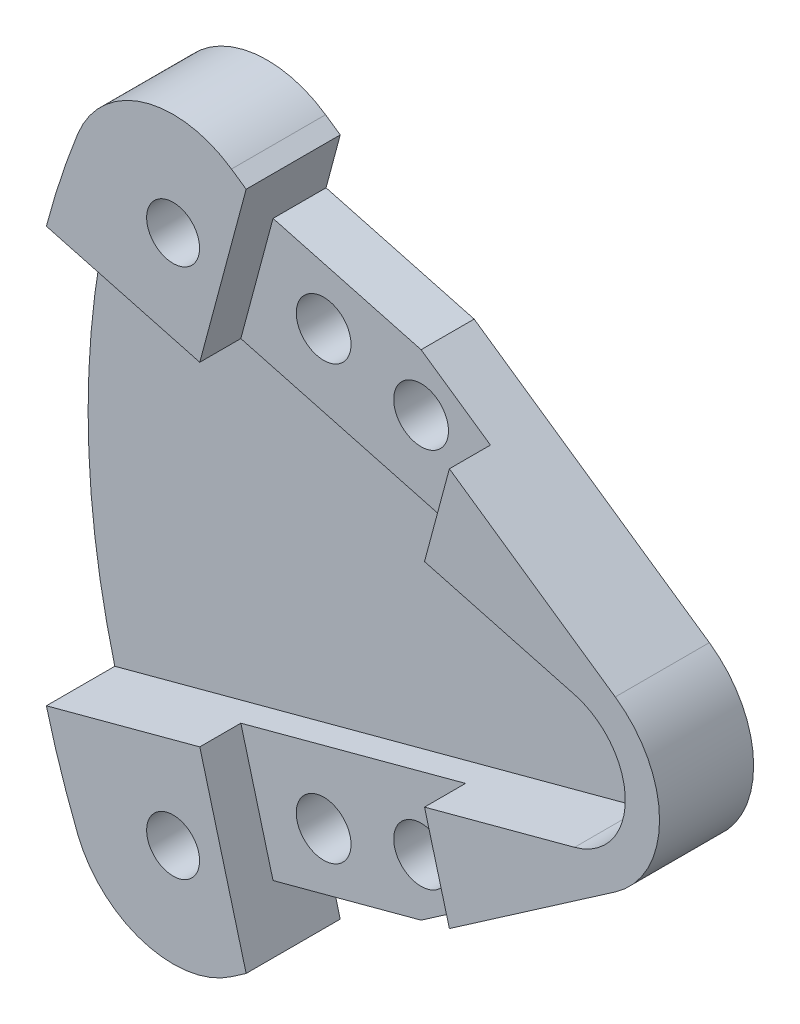
ISO-10303-21;
HEADER;
FILE_DESCRIPTION(('STEP AP214'),'2;1');
FILE_NAME('part.step','',(''),(''),'','','');
FILE_SCHEMA(('AUTOMOTIVE_DESIGN { 1 0 10303 214 1 1 1 1 }'));
ENDSEC;
DATA;
#1=APPLICATION_CONTEXT('core data for automotive mechanical design processes');
#2=APPLICATION_PROTOCOL_DEFINITION('international standard','automotive_design',2000,#1);
#3=PRODUCT_CONTEXT('',#1,'mechanical');
#4=PRODUCT('Part','Part','',(#3));
#5=PRODUCT_RELATED_PRODUCT_CATEGORY('part','',(#4));
#6=PRODUCT_DEFINITION_FORMATION('','',#4);
#7=PRODUCT_DEFINITION_CONTEXT('part definition',#1,'design');
#8=PRODUCT_DEFINITION('design','',#6,#7);
#9=PRODUCT_DEFINITION_SHAPE('','',#8);
#10=(LENGTH_UNIT() NAMED_UNIT(*) SI_UNIT(.MILLI.,.METRE.));
#11=(NAMED_UNIT(*) PLANE_ANGLE_UNIT() SI_UNIT($,.RADIAN.));
#12=(NAMED_UNIT(*) SI_UNIT($,.STERADIAN.) SOLID_ANGLE_UNIT());
#13=UNCERTAINTY_MEASURE_WITH_UNIT(LENGTH_MEASURE(1.E-05),#10,'distance_accuracy_value','');
#14=(GEOMETRIC_REPRESENTATION_CONTEXT(3) GLOBAL_UNCERTAINTY_ASSIGNED_CONTEXT((#13)) GLOBAL_UNIT_ASSIGNED_CONTEXT((#10,
#11,#12)) REPRESENTATION_CONTEXT('',''));
#15=CARTESIAN_POINT('',(0.,0.,0.));
#16=DIRECTION('',(0.,0.,1.));
#17=DIRECTION('',(1.,0.,0.));
#18=AXIS2_PLACEMENT_3D('',#15,#16,#17);
#19=CARTESIAN_POINT('',(33.2996809294023,0.,-8.73125));
#20=DIRECTION('',(-0.568627450980392,0.822595175035413,0.));
#21=DIRECTION('',(-0.822595175035413,-0.568627450980392,0.));
#22=AXIS2_PLACEMENT_3D('',#19,#20,#21);
#23=PLANE('',#22);
#24=DIRECTION('',(0.822595175035413,0.568627450980392,0.));
#25=VECTOR('',#24,1.);
#26=CARTESIAN_POINT('',(33.2996809294023,0.,-8.73125));
#27=LINE('',#26,#25);
#28=CARTESIAN_POINT('',(-13.64748248226,-32.4527138885591,-8.73125));
#29=VERTEX_POINT('',#28);
#30=CARTESIAN_POINT('',(-12.2859096671348,-31.5115125507863,-8.73125));
#31=VERTEX_POINT('',#30);
#32=EDGE_CURVE('E229',#29,#31,#27,.T.);
#33=ORIENTED_EDGE('',*,*,#32,.T.);
#34=DIRECTION('',(0.,0.,-1.));
#35=VECTOR('',#34,1.);
#36=CARTESIAN_POINT('',(-12.2859096671348,-31.5115125507863,-8.73125));
#37=LINE('',#36,#35);
#38=CARTESIAN_POINT('',(-12.2859096671348,-31.5115125507863,0.));
#39=VERTEX_POINT('',#38);
#40=EDGE_CURVE('E210',#39,#31,#37,.T.);
#41=ORIENTED_EDGE('',*,*,#40,.F.);
#42=DIRECTION('',(0.822595175035413,0.568627450980392,0.));
#43=VECTOR('',#42,1.);
#44=CARTESIAN_POINT('',(33.2996809294023,0.,0.));
#45=LINE('',#44,#43);
#46=CARTESIAN_POINT('',(-13.64748248226,-32.4527138885591,0.));
#47=VERTEX_POINT('',#46);
#48=EDGE_CURVE('E247',#47,#39,#45,.T.);
#49=ORIENTED_EDGE('',*,*,#48,.F.);
#50=DIRECTION('',(0.,0.,1.));
#51=VECTOR('',#50,1.);
#52=CARTESIAN_POINT('',(-13.64748248226,-32.4527138885591,0.));
#53=LINE('',#52,#51);
#54=EDGE_CURVE('E66',#29,#47,#53,.T.);
#55=ORIENTED_EDGE('',*,*,#54,.F.);
#56=EDGE_LOOP('',(#33,#41,#49,#55));
#57=FACE_BOUND('',#56,.T.);
#58=ADVANCED_FACE('F57',(#57),#23,.F.);
#59=CARTESIAN_POINT('',(33.2996809294023,0.,-8.73125));
#60=DIRECTION('',(-0.568627450980392,-0.822595175035413,0.));
#61=DIRECTION('',(0.822595175035413,-0.568627450980392,0.));
#62=AXIS2_PLACEMENT_3D('',#59,#60,#61);
#63=PLANE('',#62);
#64=DIRECTION('',(0.,0.,1.));
#65=VECTOR('',#64,1.);
#66=CARTESIAN_POINT('',(-12.2859096671348,31.5115125507863,-8.73125));
#67=LINE('',#66,#65);
#68=CARTESIAN_POINT('',(-12.2859096671348,31.5115125507863,-8.73125));
#69=VERTEX_POINT('',#68);
#70=CARTESIAN_POINT('',(-12.2859096671348,31.5115125507863,0.));
#71=VERTEX_POINT('',#70);
#72=EDGE_CURVE('E343',#69,#71,#67,.T.);
#73=ORIENTED_EDGE('',*,*,#72,.F.);
#74=DIRECTION('',(-0.822595175035413,0.568627450980392,0.));
#75=VECTOR('',#74,1.);
#76=CARTESIAN_POINT('',(33.2996809294023,0.,-8.73125));
#77=LINE('',#76,#75);
#78=CARTESIAN_POINT('',(-13.64748248226,32.4527138885591,-8.73125));
#79=VERTEX_POINT('',#78);
#80=EDGE_CURVE('E235',#69,#79,#77,.T.);
#81=ORIENTED_EDGE('',*,*,#80,.T.);
#82=DIRECTION('',(0.,0.,1.));
#83=VECTOR('',#82,1.);
#84=CARTESIAN_POINT('',(-13.64748248226,32.4527138885591,-8.73125));
#85=LINE('',#84,#83);
#86=CARTESIAN_POINT('',(-13.64748248226,32.4527138885591,0.));
#87=VERTEX_POINT('',#86);
#88=EDGE_CURVE('E272',#87,#79,#85,.F.);
#89=ORIENTED_EDGE('',*,*,#88,.F.);
#90=DIRECTION('',(-0.822595175035413,0.568627450980392,0.));
#91=VECTOR('',#90,1.);
#92=CARTESIAN_POINT('',(33.2996809294023,0.,0.));
#93=LINE('',#92,#91);
#94=EDGE_CURVE('E249',#71,#87,#93,.T.);
#95=ORIENTED_EDGE('',*,*,#94,.F.);
#96=EDGE_LOOP('',(#73,#81,#89,#95));
#97=FACE_BOUND('',#96,.T.);
#98=ADVANCED_FACE('F471',(#97),#63,.F.);
#99=CARTESIAN_POINT('',(0.,0.,0.));
#100=DIRECTION('',(0.,0.,1.));
#101=DIRECTION('',(-1.,0.,0.));
#102=AXIS2_PLACEMENT_3D('',#99,#100,#101);
#103=PLANE('',#102);
#104=DIRECTION('',(-0.258819045102521,0.965925826289068,0.));
#105=VECTOR('',#104,1.);
#106=CARTESIAN_POINT('',(-16.588726312697,-15.4531822138951,0.));
#107=LINE('',#106,#105);
#108=CARTESIAN_POINT('',(-16.588726312697,-15.4531822138951,0.));
#109=VERTEX_POINT('',#108);
#110=EDGE_CURVE('E216',#39,#109,#107,.T.);
#111=ORIENTED_EDGE('',*,*,#110,.T.);
#112=DIRECTION('',(-0.965925826289068,-0.258819045102522,0.));
#113=VECTOR('',#112,1.);
#114=CARTESIAN_POINT('',(-30.8235420478515,-19.2673895945356,0.));
#115=LINE('',#114,#113);
#116=CARTESIAN_POINT('',(-30.8235420478515,-19.2673895945356,0.));
#117=VERTEX_POINT('',#116);
#118=EDGE_CURVE('E291',#109,#117,#115,.T.);
#119=ORIENTED_EDGE('',*,*,#118,.T.);
#120=CARTESIAN_POINT('',(42.9003190705977,0.,0.));
#121=DIRECTION('',(0.,0.,-1.));
#122=DIRECTION('',(-1.,0.,0.));
#123=AXIS2_PLACEMENT_3D('',#120,#121,#122);
#124=CIRCLE('',#123,76.2);
#125=CARTESIAN_POINT('',(-27.9156558133405,-28.1342798243964,0.));
#126=VERTEX_POINT('',#125);
#127=EDGE_CURVE('E254',#126,#117,#124,.T.);
#128=ORIENTED_EDGE('',*,*,#127,.F.);
#129=CARTESIAN_POINT('',(-19.0636589528482,-24.6174948463468,0.));
#130=DIRECTION('',(0.,0.,-1.));
#131=DIRECTION('',(-1.,0.,0.));
#132=AXIS2_PLACEMENT_3D('',#129,#130,#131);
#133=CIRCLE('',#132,9.525);
#134=EDGE_CURVE('E261',#47,#126,#133,.T.);
#135=ORIENTED_EDGE('',*,*,#134,.F.);
#136=ORIENTED_EDGE('',*,*,#48,.T.);
#137=EDGE_LOOP('',(#111,#119,#128,#135,#136));
#138=FACE_BOUND('',#137,.T.);
#139=CARTESIAN_POINT('',(-19.0636589528482,-24.6174948463468,0.));
#140=DIRECTION('',(0.,0.,-1.));
#141=DIRECTION('',(-1.,0.,0.));
#142=AXIS2_PLACEMENT_3D('',#139,#140,#141);
#143=CIRCLE('',#142,2.45745);
#144=CARTESIAN_POINT('',(-21.5211089528482,-24.6174948463468,0.));
#145=VERTEX_POINT('',#144);
#146=EDGE_CURVE('E306',#145,#145,#143,.T.);
#147=ORIENTED_EDGE('',*,*,#146,.T.);
#148=EDGE_LOOP('',(#147));
#149=FACE_BOUND('',#148,.T.);
#150=ADVANCED_FACE('F287',(#138,#149),#103,.T.);
#151=DIRECTION('',(0.258819045102521,0.965925826289068,0.));
#152=VECTOR('',#151,1.);
#153=CARTESIAN_POINT('',(-16.588726312697,15.4531822138951,0.));
#154=LINE('',#153,#152);
#155=CARTESIAN_POINT('',(-16.588726312697,15.4531822138951,0.));
#156=VERTEX_POINT('',#155);
#157=EDGE_CURVE('E363',#156,#71,#154,.T.);
#158=ORIENTED_EDGE('',*,*,#157,.T.);
#159=ORIENTED_EDGE('',*,*,#94,.T.);
#160=CARTESIAN_POINT('',(-19.0636589528482,24.6174948463468,0.));
#161=DIRECTION('',(0.,0.,-1.));
#162=DIRECTION('',(-1.,0.,0.));
#163=AXIS2_PLACEMENT_3D('',#160,#161,#162);
#164=CIRCLE('',#163,9.525);
#165=CARTESIAN_POINT('',(-27.9156558133405,28.1342798243964,0.));
#166=VERTEX_POINT('',#165);
#167=EDGE_CURVE('E266',#166,#87,#164,.T.);
#168=ORIENTED_EDGE('',*,*,#167,.F.);
#169=CARTESIAN_POINT('',(-30.8235420478515,19.2673895945356,0.));
#170=VERTEX_POINT('',#169);
#171=EDGE_CURVE('E246',#170,#166,#124,.T.);
#172=ORIENTED_EDGE('',*,*,#171,.F.);
#173=DIRECTION('',(0.965925826289068,-0.258819045102522,0.));
#174=VECTOR('',#173,1.);
#175=CARTESIAN_POINT('',(-30.8235420478515,19.2673895945356,0.));
#176=LINE('',#175,#174);
#177=EDGE_CURVE('E327',#170,#156,#176,.T.);
#178=ORIENTED_EDGE('',*,*,#177,.T.);
#179=EDGE_LOOP('',(#158,#159,#168,#172,#178));
#180=FACE_BOUND('',#179,.T.);
#181=CARTESIAN_POINT('',(-19.0636589528482,24.6174948463468,0.));
#182=DIRECTION('',(0.,0.,-1.));
#183=DIRECTION('',(-1.,0.,0.));
#184=AXIS2_PLACEMENT_3D('',#181,#182,#183);
#185=CIRCLE('',#184,2.45745);
#186=CARTESIAN_POINT('',(-21.5211089528482,24.6174948463468,0.));
#187=VERTEX_POINT('',#186);
#188=EDGE_CURVE('E302',#187,#187,#185,.T.);
#189=ORIENTED_EDGE('',*,*,#188,.T.);
#190=EDGE_LOOP('',(#189));
#191=FACE_BOUND('',#190,.T.);
#192=ADVANCED_FACE('F463',(#180,#191),#103,.T.);
#193=CARTESIAN_POINT('',(16.5488188604368,0.,-8.73125));
#194=DIRECTION('',(0.,0.,-1.));
#195=DIRECTION('',(1.,0.,0.));
#196=AXIS2_PLACEMENT_3D('',#193,#194,#195);
#197=CYLINDRICAL_SURFACE('',#196,2.45745);
#198=CARTESIAN_POINT('',(16.5488188604368,0.,-6.35));
#199=DIRECTION('',(0.,0.,-1.));
#200=DIRECTION('',(-1.,0.,0.));
#201=AXIS2_PLACEMENT_3D('',#198,#199,#200);
#202=CIRCLE('',#201,2.45745);
#203=CARTESIAN_POINT('',(14.0913688604368,0.,-6.35));
#204=VERTEX_POINT('',#203);
#205=EDGE_CURVE('E61',#204,#204,#202,.F.);
#206=ORIENTED_EDGE('',*,*,#205,.T.);
#207=EDGE_LOOP('',(#206));
#208=FACE_BOUND('',#207,.T.);
#209=CARTESIAN_POINT('',(16.5488188604368,0.,-8.73125));
#210=DIRECTION('',(0.,0.,-1.));
#211=DIRECTION('',(-1.,0.,0.));
#212=AXIS2_PLACEMENT_3D('',#209,#210,#211);
#213=CIRCLE('',#212,2.45745);
#214=CARTESIAN_POINT('',(14.0913688604368,0.,-8.73125));
#215=VERTEX_POINT('',#214);
#216=EDGE_CURVE('E413',#215,#215,#213,.T.);
#217=ORIENTED_EDGE('',*,*,#216,.T.);
#218=EDGE_LOOP('',(#217));
#219=FACE_BOUND('',#218,.T.);
#220=ADVANCED_FACE('F524',(#208,#219),#197,.F.);
#221=CARTESIAN_POINT('',(0.,0.,-8.73125));
#222=DIRECTION('',(0.,0.,1.));
#223=DIRECTION('',(-1.,0.,0.));
#224=AXIS2_PLACEMENT_3D('',#221,#222,#223);
#225=PLANE('',#224);
#226=CARTESIAN_POINT('',(0.136283199039551,-17.6640652348489,-8.73125));
#227=DIRECTION('',(0.,0.,1.));
#228=DIRECTION('',(1.,0.,0.));
#229=AXIS2_PLACEMENT_3D('',#226,#227,#228);
#230=CIRCLE('',#229,2.54);
#231=CARTESIAN_POINT('',(2.67628319903955,-17.6640652348489,-8.73125));
#232=VERTEX_POINT('',#231);
#233=EDGE_CURVE('E394',#232,#232,#230,.F.);
#234=ORIENTED_EDGE('',*,*,#233,.F.);
#235=EDGE_LOOP('',(#234));
#236=FACE_BOUND('',#235,.T.);
#237=CARTESIAN_POINT('',(-8.9046859424435,20.086585615104,-8.73125));
#238=DIRECTION('',(0.,0.,1.));
#239=DIRECTION('',(1.,0.,0.));
#240=AXIS2_PLACEMENT_3D('',#237,#238,#239);
#241=CIRCLE('',#240,2.54);
#242=CARTESIAN_POINT('',(-6.36468594244349,20.086585615104,-8.73125));
#243=VERTEX_POINT('',#242);
#244=EDGE_CURVE('E395',#243,#243,#241,.F.);
#245=ORIENTED_EDGE('',*,*,#244,.F.);
#246=EDGE_LOOP('',(#245));
#247=FACE_BOUND('',#246,.T.);
#248=CARTESIAN_POINT('',(0.136283199039557,17.6640652348489,-8.73125));
#249=DIRECTION('',(0.,0.,1.));
#250=DIRECTION('',(1.,0.,0.));
#251=AXIS2_PLACEMENT_3D('',#248,#249,#250);
#252=CIRCLE('',#251,2.54);
#253=CARTESIAN_POINT('',(2.67628319903956,17.6640652348489,-8.73125));
#254=VERTEX_POINT('',#253);
#255=EDGE_CURVE('E402',#254,#254,#252,.F.);
#256=ORIENTED_EDGE('',*,*,#255,.F.);
#257=EDGE_LOOP('',(#256));
#258=FACE_BOUND('',#257,.T.);
#259=CARTESIAN_POINT('',(-8.9046859424435,-20.086585615104,-8.73125));
#260=DIRECTION('',(0.,0.,1.));
#261=DIRECTION('',(1.,0.,0.));
#262=AXIS2_PLACEMENT_3D('',#259,#260,#261);
#263=CIRCLE('',#262,2.54);
#264=CARTESIAN_POINT('',(-6.3646859424435,-20.086585615104,-8.73125));
#265=VERTEX_POINT('',#264);
#266=EDGE_CURVE('E366',#265,#265,#263,.F.);
#267=ORIENTED_EDGE('',*,*,#266,.F.);
#268=EDGE_LOOP('',(#267));
#269=FACE_BOUND('',#268,.T.);
#270=DIRECTION('',(-0.965925826289068,-0.258819045102521,0.));
#271=VECTOR('',#270,1.);
#272=CARTESIAN_POINT('',(-13.6008416103196,-26.6041197303254,-8.73125));
#273=LINE('',#272,#271);
#274=CARTESIAN_POINT('',(0.139294206400589,-22.9224614343413,-8.73125));
#275=VERTEX_POINT('',#274);
#276=CARTESIAN_POINT('',(-13.6008416103196,-26.6041197303254,-8.73125));
#277=VERTEX_POINT('',#276);
#278=EDGE_CURVE('E231',#275,#277,#273,.T.);
#279=ORIENTED_EDGE('',*,*,#278,.T.);
#280=DIRECTION('',(0.258819045102522,-0.965925826289068,0.));
#281=VECTOR('',#280,1.);
#282=CARTESIAN_POINT('',(-12.2859096671348,-31.5115125507863,-8.73125));
#283=LINE('',#282,#281);
#284=EDGE_CURVE('E213',#277,#31,#283,.T.);
#285=ORIENTED_EDGE('',*,*,#284,.T.);
#286=ORIENTED_EDGE('',*,*,#32,.F.);
#287=CARTESIAN_POINT('',(-19.0636589528482,-24.6174948463468,-8.73125));
#288=DIRECTION('',(0.,0.,-1.));
#289=DIRECTION('',(-1.,0.,0.));
#290=AXIS2_PLACEMENT_3D('',#287,#288,#289);
#291=CIRCLE('',#290,9.525);
#292=CARTESIAN_POINT('',(-27.9156558133405,-28.1342798243964,-8.73125));
#293=VERTEX_POINT('',#292);
#294=EDGE_CURVE('E275',#293,#29,#291,.F.);
#295=ORIENTED_EDGE('',*,*,#294,.F.);
#296=CARTESIAN_POINT('',(42.9003190705977,0.,-8.73125));
#297=DIRECTION('',(0.,0.,1.));
#298=DIRECTION('',(1.,0.,0.));
#299=AXIS2_PLACEMENT_3D('',#296,#297,#298);
#300=CIRCLE('',#299,76.2);
#301=CARTESIAN_POINT('',(-27.9156558133405,28.1342798243964,-8.73125));
#302=VERTEX_POINT('',#301);
#303=EDGE_CURVE('E242',#302,#293,#300,.T.);
#304=ORIENTED_EDGE('',*,*,#303,.F.);
#305=CARTESIAN_POINT('',(-19.0636589528482,24.6174948463468,-8.73125));
#306=DIRECTION('',(0.,0.,-1.));
#307=DIRECTION('',(-1.,0.,0.));
#308=AXIS2_PLACEMENT_3D('',#305,#306,#307);
#309=CIRCLE('',#308,9.525);
#310=EDGE_CURVE('E280',#79,#302,#309,.F.);
#311=ORIENTED_EDGE('',*,*,#310,.F.);
#312=ORIENTED_EDGE('',*,*,#80,.F.);
#313=DIRECTION('',(-0.258819045102521,-0.965925826289068,0.));
#314=VECTOR('',#313,1.);
#315=CARTESIAN_POINT('',(-12.2859096671348,31.5115125507863,-8.73125));
#316=LINE('',#315,#314);
#317=CARTESIAN_POINT('',(-13.6008416103194,26.6041197303259,-8.73125));
#318=VERTEX_POINT('',#317);
#319=EDGE_CURVE('E430',#69,#318,#316,.T.);
#320=ORIENTED_EDGE('',*,*,#319,.T.);
#321=DIRECTION('',(0.96592582628906,-0.258819045102551,0.));
#322=VECTOR('',#321,1.);
#323=CARTESIAN_POINT('',(-13.6008416103194,26.6041197303259,-8.73125));
#324=LINE('',#323,#322);
#325=CARTESIAN_POINT('',(0.139294206400574,22.9224614343413,-8.73125));
#326=VERTEX_POINT('',#325);
#327=EDGE_CURVE('E425',#318,#326,#324,.T.);
#328=ORIENTED_EDGE('',*,*,#327,.T.);
#329=CARTESIAN_POINT('',(21.964995331025,7.83521904221231,-8.73125));
#330=VERTEX_POINT('',#329);
#331=EDGE_CURVE('E238',#330,#326,#77,.T.);
#332=ORIENTED_EDGE('',*,*,#331,.F.);
#333=CARTESIAN_POINT('',(16.5488188604368,0.,-8.73125));
#334=DIRECTION('',(0.,0.,-1.));
#335=DIRECTION('',(-1.,0.,0.));
#336=AXIS2_PLACEMENT_3D('',#333,#334,#335);
#337=CIRCLE('',#336,9.525);
#338=CARTESIAN_POINT('',(21.964995331025,-7.83521904221231,-8.73125));
#339=VERTEX_POINT('',#338);
#340=EDGE_CURVE('E277',#339,#330,#337,.F.);
#341=ORIENTED_EDGE('',*,*,#340,.F.);
#342=EDGE_CURVE('E236',#275,#339,#27,.T.);
#343=ORIENTED_EDGE('',*,*,#342,.F.);
#344=EDGE_LOOP('',(#279,#285,#286,#295,#304,#311,#312,#320,#328,#332,#341,#343));
#345=FACE_BOUND('',#344,.T.);
#346=ORIENTED_EDGE('',*,*,#216,.F.);
#347=EDGE_LOOP('',(#346));
#348=FACE_BOUND('',#347,.T.);
#349=CARTESIAN_POINT('',(-19.0636589528482,24.6174948463468,-8.73125));
#350=DIRECTION('',(0.,0.,-1.));
#351=DIRECTION('',(-1.,0.,0.));
#352=AXIS2_PLACEMENT_3D('',#349,#350,#351);
#353=CIRCLE('',#352,2.45745);
#354=CARTESIAN_POINT('',(-21.5211089528482,24.6174948463468,-8.73125));
#355=VERTEX_POINT('',#354);
#356=EDGE_CURVE('E416',#355,#355,#353,.T.);
#357=ORIENTED_EDGE('',*,*,#356,.F.);
#358=EDGE_LOOP('',(#357));
#359=FACE_BOUND('',#358,.T.);
#360=CARTESIAN_POINT('',(-19.0636589528482,-24.6174948463468,-8.73125));
#361=DIRECTION('',(0.,0.,-1.));
#362=DIRECTION('',(-1.,0.,0.));
#363=AXIS2_PLACEMENT_3D('',#360,#361,#362);
#364=CIRCLE('',#363,2.45745);
#365=CARTESIAN_POINT('',(-21.5211089528482,-24.6174948463468,-8.73125));
#366=VERTEX_POINT('',#365);
#367=EDGE_CURVE('E419',#366,#366,#364,.T.);
#368=ORIENTED_EDGE('',*,*,#367,.F.);
#369=EDGE_LOOP('',(#368));
#370=FACE_BOUND('',#369,.T.);
#371=ADVANCED_FACE('F226',(#236,#247,#258,#269,#345,#348,#359,#370),#225,.F.);
#372=DIRECTION('',(0.822595175035413,0.568627450980392,0.));
#373=VECTOR('',#372,1.);
#374=CARTESIAN_POINT('',(33.2996809294023,0.,-3.81));
#375=LINE('',#374,#373);
#376=CARTESIAN_POINT('',(0.139294206400582,-22.9224614343413,-3.81));
#377=VERTEX_POINT('',#376);
#378=CARTESIAN_POINT('',(6.57266728433622,-18.4753255337996,-3.81));
#379=VERTEX_POINT('',#378);
#380=EDGE_CURVE('E341',#377,#379,#375,.T.);
#381=ORIENTED_EDGE('',*,*,#380,.F.);
#382=DIRECTION('',(0.,0.,1.));
#383=VECTOR('',#382,1.);
#384=CARTESIAN_POINT('',(0.139294206400589,-22.9224614343413,-8.73125));
#385=LINE('',#384,#383);
#386=EDGE_CURVE('E81',#275,#377,#385,.T.);
#387=ORIENTED_EDGE('',*,*,#386,.F.);
#388=ORIENTED_EDGE('',*,*,#342,.T.);
#389=DIRECTION('',(0.,0.,1.));
#390=VECTOR('',#389,1.);
#391=CARTESIAN_POINT('',(21.964995331025,-7.83521904221231,-8.73125));
#392=LINE('',#391,#390);
#393=CARTESIAN_POINT('',(21.964995331025,-7.83521904221231,0.));
#394=VERTEX_POINT('',#393);
#395=EDGE_CURVE('E12',#394,#339,#392,.F.);
#396=ORIENTED_EDGE('',*,*,#395,.F.);
#397=CARTESIAN_POINT('',(6.57266728433622,-18.4753255337996,0.));
#398=VERTEX_POINT('',#397);
#399=EDGE_CURVE('E250',#398,#394,#45,.T.);
#400=ORIENTED_EDGE('',*,*,#399,.F.);
#401=DIRECTION('',(0.,0.,1.));
#402=VECTOR('',#401,1.);
#403=CARTESIAN_POINT('',(6.57266728433623,-18.4753255337996,-8.73125));
#404=LINE('',#403,#402);
#405=EDGE_CURVE('E222',#379,#398,#404,.T.);
#406=ORIENTED_EDGE('',*,*,#405,.F.);
#407=EDGE_LOOP('',(#381,#387,#388,#396,#400,#406));
#408=FACE_BOUND('',#407,.T.);
#409=ADVANCED_FACE('F486',(#408),#23,.F.);
#410=ORIENTED_EDGE('',*,*,#331,.T.);
#411=DIRECTION('',(0.,0.,1.));
#412=VECTOR('',#411,1.);
#413=CARTESIAN_POINT('',(0.139294206400574,22.9224614343413,-8.73125));
#414=LINE('',#413,#412);
#415=CARTESIAN_POINT('',(0.139294206400574,22.9224614343413,-3.81));
#416=VERTEX_POINT('',#415);
#417=EDGE_CURVE('E424',#326,#416,#414,.T.);
#418=ORIENTED_EDGE('',*,*,#417,.T.);
#419=DIRECTION('',(0.822595175035413,-0.568627450980392,0.));
#420=VECTOR('',#419,1.);
#421=CARTESIAN_POINT('',(33.2996809294023,0.,-3.81));
#422=LINE('',#421,#420);
#423=CARTESIAN_POINT('',(6.57266728433622,18.4753255337996,-3.81));
#424=VERTEX_POINT('',#423);
#425=EDGE_CURVE('E349',#416,#424,#422,.T.);
#426=ORIENTED_EDGE('',*,*,#425,.T.);
#427=DIRECTION('',(0.,0.,-1.));
#428=VECTOR('',#427,1.);
#429=CARTESIAN_POINT('',(6.57266728433623,18.4753255337996,-8.73125));
#430=LINE('',#429,#428);
#431=CARTESIAN_POINT('',(6.57266728433622,18.4753255337996,0.));
#432=VERTEX_POINT('',#431);
#433=EDGE_CURVE('E345',#432,#424,#430,.T.);
#434=ORIENTED_EDGE('',*,*,#433,.F.);
#435=CARTESIAN_POINT('',(21.964995331025,7.83521904221231,0.));
#436=VERTEX_POINT('',#435);
#437=EDGE_CURVE('E240',#436,#432,#93,.T.);
#438=ORIENTED_EDGE('',*,*,#437,.F.);
#439=DIRECTION('',(0.,0.,1.));
#440=VECTOR('',#439,1.);
#441=CARTESIAN_POINT('',(21.964995331025,7.83521904221231,-8.73125));
#442=LINE('',#441,#440);
#443=EDGE_CURVE('E269',#330,#436,#442,.T.);
#444=ORIENTED_EDGE('',*,*,#443,.F.);
#445=EDGE_LOOP('',(#410,#418,#426,#434,#438,#444));
#446=FACE_BOUND('',#445,.T.);
#447=ADVANCED_FACE('F478',(#446),#63,.F.);
#448=DIRECTION('',(0.258819045102521,-0.965925826289068,0.));
#449=VECTOR('',#448,1.);
#450=CARTESIAN_POINT('',(4.26561227688399,-9.86527903013167,0.));
#451=LINE('',#450,#449);
#452=CARTESIAN_POINT('',(4.26561227688399,-9.86527903013167,0.));
#453=VERTEX_POINT('',#452);
#454=EDGE_CURVE('E379',#453,#398,#451,.T.);
#455=ORIENTED_EDGE('',*,*,#454,.T.);
#456=ORIENTED_EDGE('',*,*,#399,.T.);
#457=CARTESIAN_POINT('',(16.5488188604368,0.,0.));
#458=DIRECTION('',(0.,0.,-1.));
#459=DIRECTION('',(-1.,0.,0.));
#460=AXIS2_PLACEMENT_3D('',#457,#458,#459);
#461=CIRCLE('',#460,9.525);
#462=EDGE_CURVE('E264',#436,#394,#461,.T.);
#463=ORIENTED_EDGE('',*,*,#462,.F.);
#464=ORIENTED_EDGE('',*,*,#437,.T.);
#465=DIRECTION('',(-0.258819045102521,-0.965925826289068,0.));
#466=VECTOR('',#465,1.);
#467=CARTESIAN_POINT('',(4.26561227688399,9.86527903013167,0.));
#468=LINE('',#467,#466);
#469=CARTESIAN_POINT('',(4.26561227688399,9.86527903013167,0.));
#470=VERTEX_POINT('',#469);
#471=EDGE_CURVE('E358',#432,#470,#468,.T.);
#472=ORIENTED_EDGE('',*,*,#471,.T.);
#473=CARTESIAN_POINT('',(18.1923197968378,6.13362899693558,0.));
#474=VERTEX_POINT('',#473);
#475=EDGE_CURVE('E221',#470,#474,#176,.T.);
#476=ORIENTED_EDGE('',*,*,#475,.T.);
#477=CARTESIAN_POINT('',(16.5488188604368,0.,0.));
#478=DIRECTION('',(0.,0.,-1.));
#479=DIRECTION('',(-1.,0.,0.));
#480=AXIS2_PLACEMENT_3D('',#477,#478,#479);
#481=CIRCLE('',#480,6.35);
#482=CARTESIAN_POINT('',(18.1923197968378,-6.13362899693558,0.));
#483=VERTEX_POINT('',#482);
#484=EDGE_CURVE('E324',#474,#483,#481,.T.);
#485=ORIENTED_EDGE('',*,*,#484,.T.);
#486=EDGE_CURVE('E320',#483,#453,#115,.T.);
#487=ORIENTED_EDGE('',*,*,#486,.T.);
#488=EDGE_LOOP('',(#455,#456,#463,#464,#472,#476,#485,#487));
#489=FACE_BOUND('',#488,.T.);
#490=ADVANCED_FACE('F494',(#489),#103,.T.);
#491=CARTESIAN_POINT('',(42.9003190705977,0.,0.));
#492=DIRECTION('',(0.,0.,-1.));
#493=DIRECTION('',(1.,0.,0.));
#494=AXIS2_PLACEMENT_3D('',#491,#492,#493);
#495=CYLINDRICAL_SURFACE('',#494,76.2);
#496=DIRECTION('',(0.,0.,1.));
#497=VECTOR('',#496,1.);
#498=CARTESIAN_POINT('',(-30.8235420478515,-19.2673895945356,-6.35));
#499=LINE('',#498,#497);
#500=CARTESIAN_POINT('',(-30.8235420478515,-19.2673895945356,-6.35));
#501=VERTEX_POINT('',#500);
#502=EDGE_CURVE('E296',#501,#117,#499,.T.);
#503=ORIENTED_EDGE('',*,*,#502,.F.);
#504=CARTESIAN_POINT('',(42.9003190705977,0.,-6.35));
#505=DIRECTION('',(0.,0.,-1.));
#506=DIRECTION('',(-1.,0.,0.));
#507=AXIS2_PLACEMENT_3D('',#504,#505,#506);
#508=CIRCLE('',#507,76.2);
#509=CARTESIAN_POINT('',(-30.8235420478515,19.2673895945356,-6.35));
#510=VERTEX_POINT('',#509);
#511=EDGE_CURVE('E323',#501,#510,#508,.T.);
#512=ORIENTED_EDGE('',*,*,#511,.T.);
#513=DIRECTION('',(0.,0.,1.));
#514=VECTOR('',#513,1.);
#515=CARTESIAN_POINT('',(-30.8235420478515,19.2673895945356,-6.35));
#516=LINE('',#515,#514);
#517=EDGE_CURVE('E312',#510,#170,#516,.T.);
#518=ORIENTED_EDGE('',*,*,#517,.T.);
#519=ORIENTED_EDGE('',*,*,#171,.T.);
#520=DIRECTION('',(0.,0.,-1.));
#521=VECTOR('',#520,1.);
#522=CARTESIAN_POINT('',(-27.9156558133405,28.1342798243964,0.));
#523=LINE('',#522,#521);
#524=EDGE_CURVE('E259',#302,#166,#523,.F.);
#525=ORIENTED_EDGE('',*,*,#524,.F.);
#526=ORIENTED_EDGE('',*,*,#303,.T.);
#527=DIRECTION('',(0.,0.,-1.));
#528=VECTOR('',#527,1.);
#529=CARTESIAN_POINT('',(-27.9156558133405,-28.1342798243964,0.));
#530=LINE('',#529,#528);
#531=EDGE_CURVE('E257',#126,#293,#530,.T.);
#532=ORIENTED_EDGE('',*,*,#531,.F.);
#533=ORIENTED_EDGE('',*,*,#127,.T.);
#534=EDGE_LOOP('',(#503,#512,#518,#519,#525,#526,#532,#533));
#535=FACE_BOUND('',#534,.T.);
#536=ADVANCED_FACE('F294',(#535),#495,.T.);
#537=CARTESIAN_POINT('',(-19.0636589528482,24.6174948463468,0.));
#538=DIRECTION('',(0.,0.,-1.));
#539=DIRECTION('',(1.,0.,0.));
#540=AXIS2_PLACEMENT_3D('',#537,#538,#539);
#541=CYLINDRICAL_SURFACE('',#540,9.525);
#542=ORIENTED_EDGE('',*,*,#310,.T.);
#543=ORIENTED_EDGE('',*,*,#524,.T.);
#544=ORIENTED_EDGE('',*,*,#167,.T.);
#545=ORIENTED_EDGE('',*,*,#88,.T.);
#546=EDGE_LOOP('',(#542,#543,#544,#545));
#547=FACE_BOUND('',#546,.T.);
#548=ADVANCED_FACE('F467',(#547),#541,.T.);
#549=CARTESIAN_POINT('',(16.5488188604368,0.,-8.73125));
#550=DIRECTION('',(0.,0.,1.));
#551=DIRECTION('',(-1.,0.,0.));
#552=AXIS2_PLACEMENT_3D('',#549,#550,#551);
#553=CYLINDRICAL_SURFACE('',#552,9.525);
#554=ORIENTED_EDGE('',*,*,#340,.T.);
#555=ORIENTED_EDGE('',*,*,#443,.T.);
#556=ORIENTED_EDGE('',*,*,#462,.T.);
#557=ORIENTED_EDGE('',*,*,#395,.T.);
#558=EDGE_LOOP('',(#554,#555,#556,#557));
#559=FACE_BOUND('',#558,.T.);
#560=ADVANCED_FACE('F483',(#559),#553,.T.);
#561=CARTESIAN_POINT('',(-19.0636589528482,-24.6174948463468,0.));
#562=DIRECTION('',(0.,0.,-1.));
#563=DIRECTION('',(1.,0.,0.));
#564=AXIS2_PLACEMENT_3D('',#561,#562,#563);
#565=CYLINDRICAL_SURFACE('',#564,9.525);
#566=ORIENTED_EDGE('',*,*,#134,.T.);
#567=ORIENTED_EDGE('',*,*,#531,.T.);
#568=ORIENTED_EDGE('',*,*,#294,.T.);
#569=ORIENTED_EDGE('',*,*,#54,.T.);
#570=EDGE_LOOP('',(#566,#567,#568,#569));
#571=FACE_BOUND('',#570,.T.);
#572=ADVANCED_FACE('F59',(#571),#565,.T.);
#573=CARTESIAN_POINT('',(-19.0636589528482,24.6174948463468,-8.73125));
#574=DIRECTION('',(0.,0.,-1.));
#575=DIRECTION('',(1.,0.,0.));
#576=AXIS2_PLACEMENT_3D('',#573,#574,#575);
#577=CYLINDRICAL_SURFACE('',#576,2.45745);
#578=ORIENTED_EDGE('',*,*,#188,.F.);
#579=EDGE_LOOP('',(#578));
#580=FACE_BOUND('',#579,.T.);
#581=ORIENTED_EDGE('',*,*,#356,.T.);
#582=EDGE_LOOP('',(#581));
#583=FACE_BOUND('',#582,.T.);
#584=ADVANCED_FACE('F563',(#580,#583),#577,.F.);
#585=CARTESIAN_POINT('',(-19.0636589528482,-24.6174948463468,-8.73125));
#586=DIRECTION('',(0.,0.,-1.));
#587=DIRECTION('',(1.,0.,0.));
#588=AXIS2_PLACEMENT_3D('',#585,#586,#587);
#589=CYLINDRICAL_SURFACE('',#588,2.45745);
#590=ORIENTED_EDGE('',*,*,#146,.F.);
#591=EDGE_LOOP('',(#590));
#592=FACE_BOUND('',#591,.T.);
#593=ORIENTED_EDGE('',*,*,#367,.T.);
#594=EDGE_LOOP('',(#593));
#595=FACE_BOUND('',#594,.T.);
#596=ADVANCED_FACE('F566',(#592,#595),#589,.F.);
#597=CARTESIAN_POINT('',(42.9003190705977,0.,-6.35));
#598=DIRECTION('',(0.,0.,1.));
#599=DIRECTION('',(-1.,0.,0.));
#600=AXIS2_PLACEMENT_3D('',#597,#598,#599);
#601=PLANE('',#600);
#602=ORIENTED_EDGE('',*,*,#511,.F.);
#603=DIRECTION('',(-0.965925826289068,-0.258819045102522,0.));
#604=VECTOR('',#603,1.);
#605=CARTESIAN_POINT('',(-30.8235420478515,-19.2673895945356,-6.35));
#606=LINE('',#605,#604);
#607=CARTESIAN_POINT('',(18.1923197968378,-6.13362899693558,-6.35));
#608=VERTEX_POINT('',#607);
#609=EDGE_CURVE('E315',#608,#501,#606,.T.);
#610=ORIENTED_EDGE('',*,*,#609,.F.);
#611=CARTESIAN_POINT('',(16.5488188604368,0.,-6.35));
#612=DIRECTION('',(0.,0.,-1.));
#613=DIRECTION('',(-1.,0.,0.));
#614=AXIS2_PLACEMENT_3D('',#611,#612,#613);
#615=CIRCLE('',#614,6.35);
#616=CARTESIAN_POINT('',(18.1923197968378,6.13362899693558,-6.35));
#617=VERTEX_POINT('',#616);
#618=EDGE_CURVE('E331',#617,#608,#615,.T.);
#619=ORIENTED_EDGE('',*,*,#618,.F.);
#620=DIRECTION('',(0.965925826289068,-0.258819045102522,0.));
#621=VECTOR('',#620,1.);
#622=CARTESIAN_POINT('',(-30.8235420478515,19.2673895945356,-6.35));
#623=LINE('',#622,#621);
#624=EDGE_CURVE('E334',#510,#617,#623,.T.);
#625=ORIENTED_EDGE('',*,*,#624,.F.);
#626=EDGE_LOOP('',(#602,#610,#619,#625));
#627=FACE_BOUND('',#626,.T.);
#628=ORIENTED_EDGE('',*,*,#205,.F.);
#629=EDGE_LOOP('',(#628));
#630=FACE_BOUND('',#629,.T.);
#631=ADVANCED_FACE('F452',(#627,#630),#601,.T.);
#632=CARTESIAN_POINT('',(-30.8235420478515,-19.2673895945356,-6.35));
#633=DIRECTION('',(0.258819045102522,-0.965925826289068,0.));
#634=DIRECTION('',(0.965925826289068,0.258819045102522,0.));
#635=AXIS2_PLACEMENT_3D('',#632,#633,#634);
#636=PLANE('',#635);
#637=DIRECTION('',(0.965925826289068,0.258819045102521,0.));
#638=VECTOR('',#637,1.);
#639=CARTESIAN_POINT('',(-16.588726312697,-15.4531822138951,-3.81));
#640=LINE('',#639,#638);
#641=CARTESIAN_POINT('',(-16.588726312697,-15.4531822138951,-3.81));
#642=VERTEX_POINT('',#641);
#643=CARTESIAN_POINT('',(4.26561227688399,-9.86527903013167,-3.81));
#644=VERTEX_POINT('',#643);
#645=EDGE_CURVE('E385',#642,#644,#640,.T.);
#646=ORIENTED_EDGE('',*,*,#645,.T.);
#647=DIRECTION('',(0.,0.,1.));
#648=VECTOR('',#647,1.);
#649=CARTESIAN_POINT('',(4.26561227688399,-9.86527903013167,-3.81));
#650=LINE('',#649,#648);
#651=EDGE_CURVE('E352',#644,#453,#650,.T.);
#652=ORIENTED_EDGE('',*,*,#651,.T.);
#653=ORIENTED_EDGE('',*,*,#486,.F.);
#654=DIRECTION('',(0.,0.,1.));
#655=VECTOR('',#654,1.);
#656=CARTESIAN_POINT('',(18.1923197968378,-6.13362899693558,-6.35));
#657=LINE('',#656,#655);
#658=EDGE_CURVE('E317',#608,#483,#657,.T.);
#659=ORIENTED_EDGE('',*,*,#658,.F.);
#660=ORIENTED_EDGE('',*,*,#609,.T.);
#661=ORIENTED_EDGE('',*,*,#502,.T.);
#662=ORIENTED_EDGE('',*,*,#118,.F.);
#663=DIRECTION('',(0.,0.,1.));
#664=VECTOR('',#663,1.);
#665=CARTESIAN_POINT('',(-16.588726312697,-15.4531822138951,-3.81));
#666=LINE('',#665,#664);
#667=EDGE_CURVE('E375',#642,#109,#666,.T.);
#668=ORIENTED_EDGE('',*,*,#667,.F.);
#669=EDGE_LOOP('',(#646,#652,#653,#659,#660,#661,#662,#668));
#670=FACE_BOUND('',#669,.T.);
#671=ADVANCED_FACE('F446',(#670),#636,.F.);
#672=CARTESIAN_POINT('',(16.5488188604368,0.,-6.35));
#673=DIRECTION('',(0.,0.,1.));
#674=DIRECTION('',(-1.,0.,0.));
#675=AXIS2_PLACEMENT_3D('',#672,#673,#674);
#676=CYLINDRICAL_SURFACE('',#675,6.35);
#677=ORIENTED_EDGE('',*,*,#484,.F.);
#678=DIRECTION('',(0.,0.,1.));
#679=VECTOR('',#678,1.);
#680=CARTESIAN_POINT('',(18.1923197968378,6.13362899693558,-6.35));
#681=LINE('',#680,#679);
#682=EDGE_CURVE('E314',#617,#474,#681,.T.);
#683=ORIENTED_EDGE('',*,*,#682,.F.);
#684=ORIENTED_EDGE('',*,*,#618,.T.);
#685=ORIENTED_EDGE('',*,*,#658,.T.);
#686=EDGE_LOOP('',(#677,#683,#684,#685));
#687=FACE_BOUND('',#686,.T.);
#688=ADVANCED_FACE('F499',(#687),#676,.F.);
#689=CARTESIAN_POINT('',(-30.8235420478515,19.2673895945356,-6.35));
#690=DIRECTION('',(0.258819045102522,0.965925826289068,0.));
#691=DIRECTION('',(-0.965925826289068,0.258819045102522,0.));
#692=AXIS2_PLACEMENT_3D('',#689,#690,#691);
#693=PLANE('',#692);
#694=ORIENTED_EDGE('',*,*,#177,.F.);
#695=ORIENTED_EDGE('',*,*,#517,.F.);
#696=ORIENTED_EDGE('',*,*,#624,.T.);
#697=ORIENTED_EDGE('',*,*,#682,.T.);
#698=ORIENTED_EDGE('',*,*,#475,.F.);
#699=DIRECTION('',(0.,0.,1.));
#700=VECTOR('',#699,1.);
#701=CARTESIAN_POINT('',(4.26561227688399,9.86527903013167,-3.81));
#702=LINE('',#701,#700);
#703=CARTESIAN_POINT('',(4.26561227688398,9.86527903013167,-3.81));
#704=VERTEX_POINT('',#703);
#705=EDGE_CURVE('E353',#704,#470,#702,.T.);
#706=ORIENTED_EDGE('',*,*,#705,.F.);
#707=DIRECTION('',(-0.965925826289068,0.258819045102521,0.));
#708=VECTOR('',#707,1.);
#709=CARTESIAN_POINT('',(-16.588726312697,15.4531822138951,-3.81));
#710=LINE('',#709,#708);
#711=CARTESIAN_POINT('',(-16.588726312697,15.4531822138951,-3.81));
#712=VERTEX_POINT('',#711);
#713=EDGE_CURVE('E356',#704,#712,#710,.T.);
#714=ORIENTED_EDGE('',*,*,#713,.T.);
#715=DIRECTION('',(0.,0.,1.));
#716=VECTOR('',#715,1.);
#717=CARTESIAN_POINT('',(-16.588726312697,15.4531822138951,-3.81));
#718=LINE('',#717,#716);
#719=EDGE_CURVE('E355',#712,#156,#718,.T.);
#720=ORIENTED_EDGE('',*,*,#719,.T.);
#721=EDGE_LOOP('',(#694,#695,#696,#697,#698,#706,#714,#720));
#722=FACE_BOUND('',#721,.T.);
#723=ADVANCED_FACE('F459',(#722),#693,.F.);
#724=CARTESIAN_POINT('',(-16.588726312697,15.4531822138951,-3.81));
#725=DIRECTION('',(-0.965925826289068,0.258819045102521,0.));
#726=DIRECTION('',(-0.258819045102521,-0.965925826289068,0.));
#727=AXIS2_PLACEMENT_3D('',#724,#725,#726);
#728=PLANE('',#727);
#729=DIRECTION('',(0.258819045102521,0.965925826289068,0.));
#730=VECTOR('',#729,1.);
#731=CARTESIAN_POINT('',(-16.588726312697,15.4531822138951,-3.81));
#732=LINE('',#731,#730);
#733=CARTESIAN_POINT('',(-13.6008416103194,26.6041197303259,-3.81));
#734=VERTEX_POINT('',#733);
#735=EDGE_CURVE('E362',#712,#734,#732,.T.);
#736=ORIENTED_EDGE('',*,*,#735,.T.);
#737=DIRECTION('',(0.,0.,1.));
#738=VECTOR('',#737,1.);
#739=CARTESIAN_POINT('',(-13.6008416103194,26.6041197303259,-8.73125));
#740=LINE('',#739,#738);
#741=EDGE_CURVE('E73',#318,#734,#740,.T.);
#742=ORIENTED_EDGE('',*,*,#741,.F.);
#743=ORIENTED_EDGE('',*,*,#319,.F.);
#744=ORIENTED_EDGE('',*,*,#72,.T.);
#745=ORIENTED_EDGE('',*,*,#157,.F.);
#746=ORIENTED_EDGE('',*,*,#719,.F.);
#747=EDGE_LOOP('',(#736,#742,#743,#744,#745,#746));
#748=FACE_BOUND('',#747,.T.);
#749=ADVANCED_FACE('F473',(#748),#728,.F.);
#750=CARTESIAN_POINT('',(4.26561227688399,9.86527903013167,-3.81));
#751=DIRECTION('',(0.965925826289068,-0.258819045102521,0.));
#752=DIRECTION('',(0.258819045102521,0.965925826289068,0.));
#753=AXIS2_PLACEMENT_3D('',#750,#751,#752);
#754=PLANE('',#753);
#755=ORIENTED_EDGE('',*,*,#471,.F.);
#756=ORIENTED_EDGE('',*,*,#433,.T.);
#757=DIRECTION('',(-0.258819045102521,-0.965925826289068,0.));
#758=VECTOR('',#757,1.);
#759=CARTESIAN_POINT('',(4.26561227688399,9.86527903013167,-3.81));
#760=LINE('',#759,#758);
#761=EDGE_CURVE('E370',#424,#704,#760,.T.);
#762=ORIENTED_EDGE('',*,*,#761,.T.);
#763=ORIENTED_EDGE('',*,*,#705,.T.);
#764=EDGE_LOOP('',(#755,#756,#762,#763));
#765=FACE_BOUND('',#764,.T.);
#766=ADVANCED_FACE('F502',(#765),#754,.F.);
#767=CARTESIAN_POINT('',(0.,0.,-3.81));
#768=DIRECTION('',(0.,0.,1.));
#769=DIRECTION('',(-1.,0.,0.));
#770=AXIS2_PLACEMENT_3D('',#767,#768,#769);
#771=PLANE('',#770);
#772=DIRECTION('',(0.96592582628906,-0.258819045102551,0.));
#773=VECTOR('',#772,1.);
#774=CARTESIAN_POINT('',(-13.6008416103194,26.6041197303259,-3.81));
#775=LINE('',#774,#773);
#776=EDGE_CURVE('E428',#734,#416,#775,.T.);
#777=ORIENTED_EDGE('',*,*,#776,.F.);
#778=ORIENTED_EDGE('',*,*,#735,.F.);
#779=ORIENTED_EDGE('',*,*,#713,.F.);
#780=ORIENTED_EDGE('',*,*,#761,.F.);
#781=ORIENTED_EDGE('',*,*,#425,.F.);
#782=EDGE_LOOP('',(#777,#778,#779,#780,#781));
#783=FACE_BOUND('',#782,.T.);
#784=CARTESIAN_POINT('',(-8.9046859424435,20.086585615104,-3.81));
#785=DIRECTION('',(0.,0.,1.));
#786=DIRECTION('',(1.,0.,0.));
#787=AXIS2_PLACEMENT_3D('',#784,#785,#786);
#788=CIRCLE('',#787,2.54);
#789=CARTESIAN_POINT('',(-6.36468594244349,20.086585615104,-3.81));
#790=VERTEX_POINT('',#789);
#791=EDGE_CURVE('E399',#790,#790,#788,.T.);
#792=ORIENTED_EDGE('',*,*,#791,.F.);
#793=EDGE_LOOP('',(#792));
#794=FACE_BOUND('',#793,.T.);
#795=CARTESIAN_POINT('',(0.136283199039557,17.6640652348489,-3.81));
#796=DIRECTION('',(0.,0.,1.));
#797=DIRECTION('',(1.,0.,0.));
#798=AXIS2_PLACEMENT_3D('',#795,#796,#797);
#799=CIRCLE('',#798,2.54);
#800=CARTESIAN_POINT('',(2.67628319903956,17.6640652348489,-3.81));
#801=VERTEX_POINT('',#800);
#802=EDGE_CURVE('E410',#801,#801,#799,.T.);
#803=ORIENTED_EDGE('',*,*,#802,.F.);
#804=EDGE_LOOP('',(#803));
#805=FACE_BOUND('',#804,.T.);
#806=ADVANCED_FACE('F506',(#783,#794,#805),#771,.T.);
#807=CARTESIAN_POINT('',(-16.588726312697,-15.4531822138951,-3.81));
#808=DIRECTION('',(-0.965925826289068,-0.258819045102521,0.));
#809=DIRECTION('',(0.258819045102521,-0.965925826289068,0.));
#810=AXIS2_PLACEMENT_3D('',#807,#808,#809);
#811=PLANE('',#810);
#812=ORIENTED_EDGE('',*,*,#110,.F.);
#813=ORIENTED_EDGE('',*,*,#40,.T.);
#814=ORIENTED_EDGE('',*,*,#284,.F.);
#815=DIRECTION('',(0.,0.,1.));
#816=VECTOR('',#815,1.);
#817=CARTESIAN_POINT('',(-13.6008416103196,-26.6041197303254,-8.73125));
#818=LINE('',#817,#816);
#819=CARTESIAN_POINT('',(-13.6008416103196,-26.6041197303254,-3.81));
#820=VERTEX_POINT('',#819);
#821=EDGE_CURVE('E422',#277,#820,#818,.T.);
#822=ORIENTED_EDGE('',*,*,#821,.T.);
#823=DIRECTION('',(-0.258819045102521,0.965925826289068,0.));
#824=VECTOR('',#823,1.);
#825=CARTESIAN_POINT('',(-16.588726312697,-15.4531822138951,-3.81));
#826=LINE('',#825,#824);
#827=EDGE_CURVE('E381',#820,#642,#826,.T.);
#828=ORIENTED_EDGE('',*,*,#827,.T.);
#829=ORIENTED_EDGE('',*,*,#667,.T.);
#830=EDGE_LOOP('',(#812,#813,#814,#822,#828,#829));
#831=FACE_BOUND('',#830,.T.);
#832=ADVANCED_FACE('F212',(#831),#811,.F.);
#833=CARTESIAN_POINT('',(4.26561227688399,-9.86527903013167,-3.81));
#834=DIRECTION('',(0.965925826289068,0.258819045102521,0.));
#835=DIRECTION('',(-0.258819045102521,0.965925826289068,0.));
#836=AXIS2_PLACEMENT_3D('',#833,#834,#835);
#837=PLANE('',#836);
#838=DIRECTION('',(0.258819045102521,-0.965925826289068,0.));
#839=VECTOR('',#838,1.);
#840=CARTESIAN_POINT('',(4.26561227688399,-9.86527903013167,-3.81));
#841=LINE('',#840,#839);
#842=EDGE_CURVE('E377',#644,#379,#841,.T.);
#843=ORIENTED_EDGE('',*,*,#842,.T.);
#844=ORIENTED_EDGE('',*,*,#405,.T.);
#845=ORIENTED_EDGE('',*,*,#454,.F.);
#846=ORIENTED_EDGE('',*,*,#651,.F.);
#847=EDGE_LOOP('',(#843,#844,#845,#846));
#848=FACE_BOUND('',#847,.T.);
#849=ADVANCED_FACE('F491',(#848),#837,.F.);
#850=CARTESIAN_POINT('',(0.,0.,-3.81));
#851=DIRECTION('',(0.,0.,-1.));
#852=DIRECTION('',(1.,0.,0.));
#853=AXIS2_PLACEMENT_3D('',#850,#851,#852);
#854=PLANE('',#853);
#855=CARTESIAN_POINT('',(0.136283199039551,-17.6640652348489,-3.81));
#856=DIRECTION('',(0.,0.,1.));
#857=DIRECTION('',(1.,0.,0.));
#858=AXIS2_PLACEMENT_3D('',#855,#856,#857);
#859=CIRCLE('',#858,2.54);
#860=CARTESIAN_POINT('',(2.67628319903955,-17.6640652348489,-3.81));
#861=VERTEX_POINT('',#860);
#862=EDGE_CURVE('E398',#861,#861,#859,.T.);
#863=ORIENTED_EDGE('',*,*,#862,.F.);
#864=EDGE_LOOP('',(#863));
#865=FACE_BOUND('',#864,.T.);
#866=CARTESIAN_POINT('',(-8.9046859424435,-20.086585615104,-3.81));
#867=DIRECTION('',(0.,0.,1.));
#868=DIRECTION('',(1.,0.,0.));
#869=AXIS2_PLACEMENT_3D('',#866,#867,#868);
#870=CIRCLE('',#869,2.54);
#871=CARTESIAN_POINT('',(-6.3646859424435,-20.086585615104,-3.81));
#872=VERTEX_POINT('',#871);
#873=EDGE_CURVE('E391',#872,#872,#870,.T.);
#874=ORIENTED_EDGE('',*,*,#873,.F.);
#875=EDGE_LOOP('',(#874));
#876=FACE_BOUND('',#875,.T.);
#877=ORIENTED_EDGE('',*,*,#827,.F.);
#878=DIRECTION('',(-0.965925826289068,-0.258819045102521,0.));
#879=VECTOR('',#878,1.);
#880=CARTESIAN_POINT('',(-13.6008416103196,-26.6041197303254,-3.81));
#881=LINE('',#880,#879);
#882=EDGE_CURVE('E232',#377,#820,#881,.T.);
#883=ORIENTED_EDGE('',*,*,#882,.F.);
#884=ORIENTED_EDGE('',*,*,#380,.T.);
#885=ORIENTED_EDGE('',*,*,#842,.F.);
#886=ORIENTED_EDGE('',*,*,#645,.F.);
#887=EDGE_LOOP('',(#877,#883,#884,#885,#886));
#888=FACE_BOUND('',#887,.T.);
#889=ADVANCED_FACE('F443',(#865,#876,#888),#854,.F.);
#890=CARTESIAN_POINT('',(-8.9046859424435,-20.086585615104,-8.73225));
#891=DIRECTION('',(0.,0.,1.));
#892=DIRECTION('',(1.,0.,0.));
#893=AXIS2_PLACEMENT_3D('',#890,#891,#892);
#894=CYLINDRICAL_SURFACE('',#893,2.54);
#895=ORIENTED_EDGE('',*,*,#873,.T.);
#896=EDGE_LOOP('',(#895));
#897=FACE_BOUND('',#896,.T.);
#898=ORIENTED_EDGE('',*,*,#266,.T.);
#899=EDGE_LOOP('',(#898));
#900=FACE_BOUND('',#899,.T.);
#901=ADVANCED_FACE('F529',(#897,#900),#894,.F.);
#902=CARTESIAN_POINT('',(0.136283199039551,-17.6640652348489,-8.73225));
#903=DIRECTION('',(0.,0.,1.));
#904=DIRECTION('',(1.,0.,0.));
#905=AXIS2_PLACEMENT_3D('',#902,#903,#904);
#906=CYLINDRICAL_SURFACE('',#905,2.54);
#907=ORIENTED_EDGE('',*,*,#862,.T.);
#908=EDGE_LOOP('',(#907));
#909=FACE_BOUND('',#908,.T.);
#910=ORIENTED_EDGE('',*,*,#233,.T.);
#911=EDGE_LOOP('',(#910));
#912=FACE_BOUND('',#911,.T.);
#913=ADVANCED_FACE('F518',(#909,#912),#906,.F.);
#914=CARTESIAN_POINT('',(0.136283199039557,17.6640652348489,-8.73225));
#915=DIRECTION('',(0.,0.,1.));
#916=DIRECTION('',(1.,0.,0.));
#917=AXIS2_PLACEMENT_3D('',#914,#915,#916);
#918=CYLINDRICAL_SURFACE('',#917,2.54);
#919=ORIENTED_EDGE('',*,*,#802,.T.);
#920=EDGE_LOOP('',(#919));
#921=FACE_BOUND('',#920,.T.);
#922=ORIENTED_EDGE('',*,*,#255,.T.);
#923=EDGE_LOOP('',(#922));
#924=FACE_BOUND('',#923,.T.);
#925=ADVANCED_FACE('F514',(#921,#924),#918,.F.);
#926=CARTESIAN_POINT('',(-8.9046859424435,20.086585615104,-8.73225));
#927=DIRECTION('',(0.,0.,1.));
#928=DIRECTION('',(1.,0.,0.));
#929=AXIS2_PLACEMENT_3D('',#926,#927,#928);
#930=CYLINDRICAL_SURFACE('',#929,2.54);
#931=ORIENTED_EDGE('',*,*,#791,.T.);
#932=EDGE_LOOP('',(#931));
#933=FACE_BOUND('',#932,.T.);
#934=ORIENTED_EDGE('',*,*,#244,.T.);
#935=EDGE_LOOP('',(#934));
#936=FACE_BOUND('',#935,.T.);
#937=ADVANCED_FACE('F517',(#933,#936),#930,.F.);
#938=CARTESIAN_POINT('',(-13.6008416103196,-26.6041197303254,-8.73125));
#939=DIRECTION('',(-0.258819045102521,0.965925826289068,0.));
#940=DIRECTION('',(-0.965925826289068,-0.258819045102521,0.));
#941=AXIS2_PLACEMENT_3D('',#938,#939,#940);
#942=PLANE('',#941);
#943=ORIENTED_EDGE('',*,*,#882,.T.);
#944=ORIENTED_EDGE('',*,*,#821,.F.);
#945=ORIENTED_EDGE('',*,*,#278,.F.);
#946=ORIENTED_EDGE('',*,*,#386,.T.);
#947=EDGE_LOOP('',(#943,#944,#945,#946));
#948=FACE_BOUND('',#947,.T.);
#949=ADVANCED_FACE('F439',(#948),#942,.F.);
#950=CARTESIAN_POINT('',(-13.6008416103194,26.6041197303259,-8.73125));
#951=DIRECTION('',(-0.258819045102551,-0.96592582628906,0.));
#952=DIRECTION('',(0.96592582628906,-0.258819045102551,0.));
#953=AXIS2_PLACEMENT_3D('',#950,#951,#952);
#954=PLANE('',#953);
#955=ORIENTED_EDGE('',*,*,#776,.T.);
#956=ORIENTED_EDGE('',*,*,#417,.F.);
#957=ORIENTED_EDGE('',*,*,#327,.F.);
#958=ORIENTED_EDGE('',*,*,#741,.T.);
#959=EDGE_LOOP('',(#955,#956,#957,#958));
#960=FACE_BOUND('',#959,.T.);
#961=ADVANCED_FACE('F474',(#960),#954,.F.);
#962=CLOSED_SHELL('',(#58,#98,#150,#192,#220,#371,#409,#447,#490,#536,#548,#560,#572,#584,#596,
#631,#671,#688,#723,#749,#766,#806,#832,#849,#889,#901,#913,#925,#937,#949,#961));
#963=MANIFOLD_SOLID_BREP('B2',#962);
#964=ADVANCED_BREP_SHAPE_REPRESENTATION('',(#18,#963),#14);
#965=SHAPE_DEFINITION_REPRESENTATION(#9,#964);
ENDSEC;
END-ISO-10303-21;
